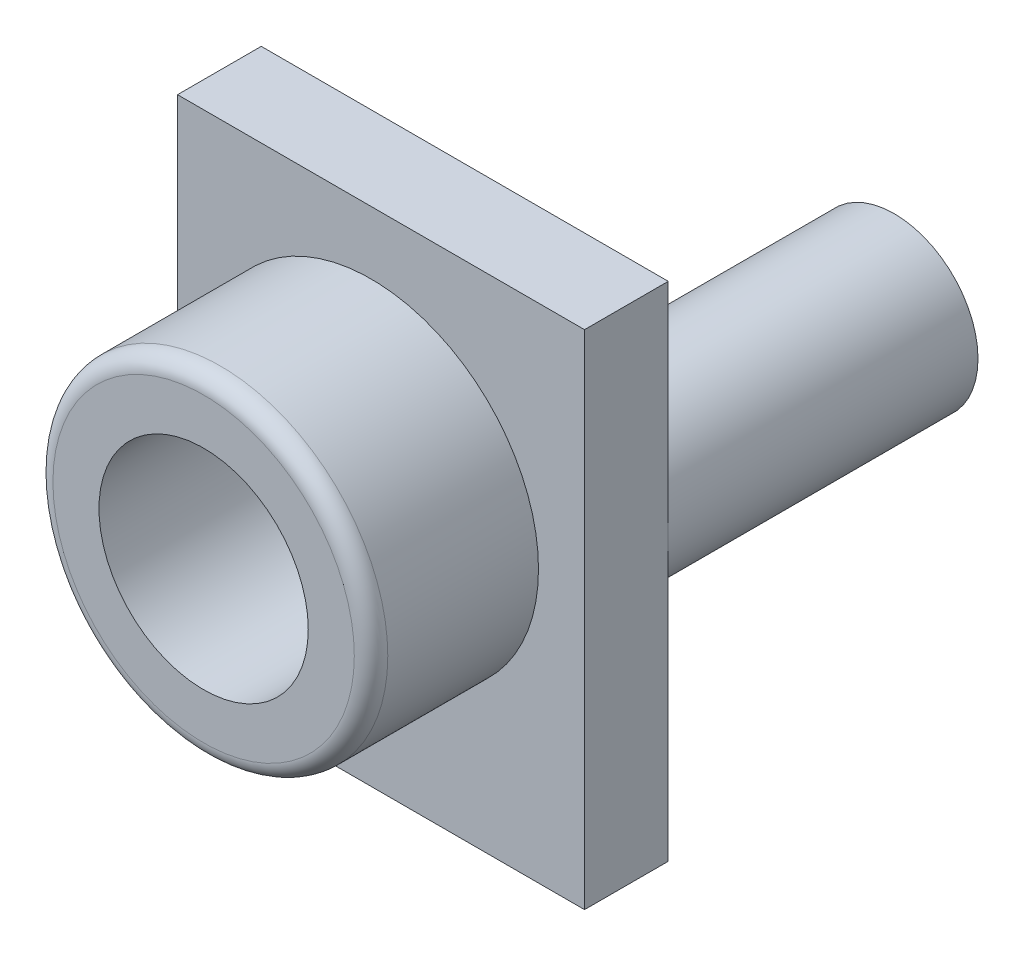
ISO-10303-21;
HEADER;
FILE_DESCRIPTION(('STEP AP214'),'2;1');
FILE_NAME('part.step','',(''),(''),'','','');
FILE_SCHEMA(('AUTOMOTIVE_DESIGN { 1 0 10303 214 1 1 1 1 }'));
ENDSEC;
DATA;
#1=APPLICATION_CONTEXT('core data for automotive mechanical design processes');
#2=APPLICATION_PROTOCOL_DEFINITION('international standard','automotive_design',2000,#1);
#3=PRODUCT_CONTEXT('',#1,'mechanical');
#4=PRODUCT('Part','Part','',(#3));
#5=PRODUCT_RELATED_PRODUCT_CATEGORY('part','',(#4));
#6=PRODUCT_DEFINITION_FORMATION('','',#4);
#7=PRODUCT_DEFINITION_CONTEXT('part definition',#1,'design');
#8=PRODUCT_DEFINITION('design','',#6,#7);
#9=PRODUCT_DEFINITION_SHAPE('','',#8);
#10=(LENGTH_UNIT() NAMED_UNIT(*) SI_UNIT(.MILLI.,.METRE.));
#11=(NAMED_UNIT(*) PLANE_ANGLE_UNIT() SI_UNIT($,.RADIAN.));
#12=(NAMED_UNIT(*) SI_UNIT($,.STERADIAN.) SOLID_ANGLE_UNIT());
#13=UNCERTAINTY_MEASURE_WITH_UNIT(LENGTH_MEASURE(1.E-05),#10,'distance_accuracy_value','');
#14=(GEOMETRIC_REPRESENTATION_CONTEXT(3) GLOBAL_UNCERTAINTY_ASSIGNED_CONTEXT((#13)) GLOBAL_UNIT_ASSIGNED_CONTEXT((#10,
#11,#12)) REPRESENTATION_CONTEXT('',''));
#15=CARTESIAN_POINT('',(0.,0.,0.));
#16=DIRECTION('',(0.,0.,1.));
#17=DIRECTION('',(1.,0.,0.));
#18=AXIS2_PLACEMENT_3D('',#15,#16,#17);
#19=CARTESIAN_POINT('',(-4.86158362662732,6.,2.));
#20=DIRECTION('',(1.,0.,0.));
#21=DIRECTION('',(0.,0.,-1.));
#22=AXIS2_PLACEMENT_3D('',#19,#20,#21);
#23=PLANE('',#22);
#24=DIRECTION('',(0.,-1.,0.));
#25=VECTOR('',#24,1.);
#26=CARTESIAN_POINT('',(-4.86158362662732,6.,0.));
#27=LINE('',#26,#25);
#28=CARTESIAN_POINT('',(-4.86158362662732,6.,0.));
#29=VERTEX_POINT('',#28);
#30=CARTESIAN_POINT('',(-4.86158362662732,-6.,0.));
#31=VERTEX_POINT('',#30);
#32=EDGE_CURVE('E103',#29,#31,#27,.T.);
#33=ORIENTED_EDGE('',*,*,#32,.T.);
#34=DIRECTION('',(0.,0.,-1.));
#35=VECTOR('',#34,1.);
#36=CARTESIAN_POINT('',(-4.86158362662732,-6.,2.));
#37=LINE('',#36,#35);
#38=CARTESIAN_POINT('',(-4.86158362662732,-6.,2.));
#39=VERTEX_POINT('',#38);
#40=EDGE_CURVE('E114',#39,#31,#37,.T.);
#41=ORIENTED_EDGE('',*,*,#40,.F.);
#42=DIRECTION('',(0.,-1.,0.));
#43=VECTOR('',#42,1.);
#44=CARTESIAN_POINT('',(-4.86158362662732,6.,2.));
#45=LINE('',#44,#43);
#46=CARTESIAN_POINT('',(-4.86158362662732,6.,2.));
#47=VERTEX_POINT('',#46);
#48=EDGE_CURVE('E108',#47,#39,#45,.T.);
#49=ORIENTED_EDGE('',*,*,#48,.F.);
#50=DIRECTION('',(0.,0.,-1.));
#51=VECTOR('',#50,1.);
#52=CARTESIAN_POINT('',(-4.86158362662732,6.,2.));
#53=LINE('',#52,#51);
#54=EDGE_CURVE('E109',#47,#29,#53,.T.);
#55=ORIENTED_EDGE('',*,*,#54,.T.);
#56=EDGE_LOOP('',(#33,#41,#49,#55));
#57=FACE_BOUND('',#56,.T.);
#58=ADVANCED_FACE('F38',(#57),#23,.F.);
#59=CARTESIAN_POINT('',(-4.86158362662732,-6.,2.));
#60=DIRECTION('',(0.,1.,0.));
#61=DIRECTION('',(0.,0.,1.));
#62=AXIS2_PLACEMENT_3D('',#59,#60,#61);
#63=PLANE('',#62);
#64=DIRECTION('',(1.,0.,0.));
#65=VECTOR('',#64,1.);
#66=CARTESIAN_POINT('',(-4.86158362662732,-6.,0.));
#67=LINE('',#66,#65);
#68=CARTESIAN_POINT('',(4.86158362662732,-6.,0.));
#69=VERTEX_POINT('',#68);
#70=EDGE_CURVE('E102',#31,#69,#67,.T.);
#71=ORIENTED_EDGE('',*,*,#70,.T.);
#72=DIRECTION('',(0.,0.,-1.));
#73=VECTOR('',#72,1.);
#74=CARTESIAN_POINT('',(4.86158362662732,-6.,2.));
#75=LINE('',#74,#73);
#76=CARTESIAN_POINT('',(4.86158362662732,-6.,2.));
#77=VERTEX_POINT('',#76);
#78=EDGE_CURVE('E94',#77,#69,#75,.T.);
#79=ORIENTED_EDGE('',*,*,#78,.F.);
#80=DIRECTION('',(1.,0.,0.));
#81=VECTOR('',#80,1.);
#82=CARTESIAN_POINT('',(-4.86158362662732,-6.,2.));
#83=LINE('',#82,#81);
#84=EDGE_CURVE('E87',#39,#77,#83,.T.);
#85=ORIENTED_EDGE('',*,*,#84,.F.);
#86=ORIENTED_EDGE('',*,*,#40,.T.);
#87=EDGE_LOOP('',(#71,#79,#85,#86));
#88=FACE_BOUND('',#87,.T.);
#89=ADVANCED_FACE('F135',(#88),#63,.F.);
#90=CARTESIAN_POINT('',(4.86158362662732,-6.,2.));
#91=DIRECTION('',(-1.,0.,0.));
#92=DIRECTION('',(0.,0.,1.));
#93=AXIS2_PLACEMENT_3D('',#90,#91,#92);
#94=PLANE('',#93);
#95=DIRECTION('',(0.,1.,0.));
#96=VECTOR('',#95,1.);
#97=CARTESIAN_POINT('',(4.86158362662732,-6.,0.));
#98=LINE('',#97,#96);
#99=CARTESIAN_POINT('',(4.86158362662732,0.700000000000001,0.));
#100=VERTEX_POINT('',#99);
#101=EDGE_CURVE('E91',#69,#100,#98,.T.);
#102=ORIENTED_EDGE('',*,*,#101,.T.);
#103=CARTESIAN_POINT('',(4.86158362662732,6.,0.));
#104=VERTEX_POINT('',#103);
#105=EDGE_CURVE('E73',#100,#104,#98,.T.);
#106=ORIENTED_EDGE('',*,*,#105,.T.);
#107=DIRECTION('',(0.,0.,-1.));
#108=VECTOR('',#107,1.);
#109=CARTESIAN_POINT('',(4.86158362662732,6.,2.));
#110=LINE('',#109,#108);
#111=CARTESIAN_POINT('',(4.86158362662732,6.,2.));
#112=VERTEX_POINT('',#111);
#113=EDGE_CURVE('E111',#112,#104,#110,.T.);
#114=ORIENTED_EDGE('',*,*,#113,.F.);
#115=DIRECTION('',(0.,1.,0.));
#116=VECTOR('',#115,1.);
#117=CARTESIAN_POINT('',(4.86158362662732,-6.,2.));
#118=LINE('',#117,#116);
#119=EDGE_CURVE('E186',#77,#112,#118,.T.);
#120=ORIENTED_EDGE('',*,*,#119,.F.);
#121=ORIENTED_EDGE('',*,*,#78,.T.);
#122=EDGE_LOOP('',(#102,#106,#114,#120,#121));
#123=FACE_BOUND('',#122,.T.);
#124=ADVANCED_FACE('F92',(#123),#94,.F.);
#125=CARTESIAN_POINT('',(4.86158362662732,6.,2.));
#126=DIRECTION('',(0.,-1.,0.));
#127=DIRECTION('',(0.,0.,-1.));
#128=AXIS2_PLACEMENT_3D('',#125,#126,#127);
#129=PLANE('',#128);
#130=DIRECTION('',(-1.,0.,0.));
#131=VECTOR('',#130,1.);
#132=CARTESIAN_POINT('',(4.86158362662732,6.,0.));
#133=LINE('',#132,#131);
#134=EDGE_CURVE('E79',#104,#29,#133,.T.);
#135=ORIENTED_EDGE('',*,*,#134,.T.);
#136=ORIENTED_EDGE('',*,*,#54,.F.);
#137=DIRECTION('',(-1.,0.,0.));
#138=VECTOR('',#137,1.);
#139=CARTESIAN_POINT('',(4.86158362662732,6.,2.));
#140=LINE('',#139,#138);
#141=EDGE_CURVE('E55',#112,#47,#140,.T.);
#142=ORIENTED_EDGE('',*,*,#141,.F.);
#143=ORIENTED_EDGE('',*,*,#113,.T.);
#144=EDGE_LOOP('',(#135,#136,#142,#143));
#145=FACE_BOUND('',#144,.T.);
#146=ADVANCED_FACE('F145',(#145),#129,.F.);
#147=CARTESIAN_POINT('',(0.,0.,2.));
#148=DIRECTION('',(0.,0.,1.));
#149=DIRECTION('',(1.,0.,0.));
#150=AXIS2_PLACEMENT_3D('',#147,#148,#149);
#151=PLANE('',#150);
#152=CARTESIAN_POINT('',(-0.238416373372685,0.499999999999999,2.));
#153=DIRECTION('',(0.,0.,1.));
#154=DIRECTION('',(1.,0.,0.));
#155=AXIS2_PLACEMENT_3D('',#152,#153,#154);
#156=CIRCLE('',#155,4.00000000000001);
#157=CARTESIAN_POINT('',(3.76158362662732,0.499999999999999,2.));
#158=VERTEX_POINT('',#157);
#159=EDGE_CURVE('E181',#158,#158,#156,.T.);
#160=ORIENTED_EDGE('',*,*,#159,.F.);
#161=EDGE_LOOP('',(#160));
#162=FACE_BOUND('',#161,.T.);
#163=ORIENTED_EDGE('',*,*,#48,.T.);
#164=ORIENTED_EDGE('',*,*,#84,.T.);
#165=ORIENTED_EDGE('',*,*,#119,.T.);
#166=ORIENTED_EDGE('',*,*,#141,.T.);
#167=EDGE_LOOP('',(#163,#164,#165,#166));
#168=FACE_BOUND('',#167,.T.);
#169=ADVANCED_FACE('F148',(#162,#168),#151,.T.);
#170=CARTESIAN_POINT('',(0.,0.,0.));
#171=DIRECTION('',(0.,0.,1.));
#172=DIRECTION('',(1.,0.,0.));
#173=AXIS2_PLACEMENT_3D('',#170,#171,#172);
#174=PLANE('',#173);
#175=ORIENTED_EDGE('',*,*,#105,.F.);
#176=CARTESIAN_POINT('',(2.86158362662732,0.700000000000001,0.));
#177=DIRECTION('',(0.,0.,-1.));
#178=DIRECTION('',(-1.,0.,0.));
#179=AXIS2_PLACEMENT_3D('',#176,#177,#178);
#180=CIRCLE('',#179,2.);
#181=EDGE_CURVE('E100',#100,#100,#180,.T.);
#182=ORIENTED_EDGE('',*,*,#181,.F.);
#183=ORIENTED_EDGE('',*,*,#101,.F.);
#184=ORIENTED_EDGE('',*,*,#70,.F.);
#185=ORIENTED_EDGE('',*,*,#32,.F.);
#186=ORIENTED_EDGE('',*,*,#134,.F.);
#187=EDGE_LOOP('',(#175,#182,#183,#184,#185,#186));
#188=FACE_BOUND('',#187,.T.);
#189=ADVANCED_FACE('F98',(#188),#174,.F.);
#190=CARTESIAN_POINT('',(-0.238416373372685,0.499999999999999,6.));
#191=DIRECTION('',(0.,0.,1.));
#192=DIRECTION('',(1.,0.,0.));
#193=AXIS2_PLACEMENT_3D('',#190,#191,#192);
#194=PLANE('',#193);
#195=CARTESIAN_POINT('',(-0.238416373372685,0.499999999999999,6.));
#196=DIRECTION('',(0.,0.,1.));
#197=DIRECTION('',(1.,0.,0.));
#198=AXIS2_PLACEMENT_3D('',#195,#196,#197);
#199=CIRCLE('',#198,3.60000000000001);
#200=CARTESIAN_POINT('',(3.36158362662732,0.499999999999999,6.));
#201=VERTEX_POINT('',#200);
#202=EDGE_CURVE('E47',#201,#201,#199,.T.);
#203=ORIENTED_EDGE('',*,*,#202,.T.);
#204=EDGE_LOOP('',(#203));
#205=FACE_BOUND('',#204,.T.);
#206=CARTESIAN_POINT('',(-0.238416373372685,0.499999999999999,6.));
#207=DIRECTION('',(0.,0.,1.));
#208=DIRECTION('',(1.,0.,0.));
#209=AXIS2_PLACEMENT_3D('',#206,#207,#208);
#210=CIRCLE('',#209,2.5);
#211=CARTESIAN_POINT('',(2.26158362662731,0.499999999999999,6.));
#212=VERTEX_POINT('',#211);
#213=EDGE_CURVE('E176',#212,#212,#210,.T.);
#214=ORIENTED_EDGE('',*,*,#213,.F.);
#215=EDGE_LOOP('',(#214));
#216=FACE_BOUND('',#215,.T.);
#217=ADVANCED_FACE('F121',(#205,#216),#194,.T.);
#218=CARTESIAN_POINT('',(-0.238416373372685,0.499999999999999,6.));
#219=DIRECTION('',(0.,0.,-1.));
#220=DIRECTION('',(-1.,0.,0.));
#221=AXIS2_PLACEMENT_3D('',#218,#219,#220);
#222=CYLINDRICAL_SURFACE('',#221,4.00000000000001);
#223=CARTESIAN_POINT('',(-0.238416373372685,0.499999999999999,5.6));
#224=DIRECTION('',(0.,0.,1.));
#225=DIRECTION('',(1.,0.,0.));
#226=AXIS2_PLACEMENT_3D('',#223,#224,#225);
#227=CIRCLE('',#226,4.00000000000001);
#228=CARTESIAN_POINT('',(3.76158362662732,0.499999999999999,5.6));
#229=VERTEX_POINT('',#228);
#230=EDGE_CURVE('E11',#229,#229,#227,.F.);
#231=ORIENTED_EDGE('',*,*,#230,.T.);
#232=EDGE_LOOP('',(#231));
#233=FACE_BOUND('',#232,.T.);
#234=ORIENTED_EDGE('',*,*,#159,.T.);
#235=EDGE_LOOP('',(#234));
#236=FACE_BOUND('',#235,.T.);
#237=ADVANCED_FACE('F155',(#233,#236),#222,.T.);
#238=CARTESIAN_POINT('',(-0.238416373372685,0.499999999999999,6.));
#239=DIRECTION('',(0.,0.,-1.));
#240=DIRECTION('',(-1.,0.,0.));
#241=AXIS2_PLACEMENT_3D('',#238,#239,#240);
#242=CYLINDRICAL_SURFACE('',#241,2.5);
#243=ORIENTED_EDGE('',*,*,#213,.T.);
#244=EDGE_LOOP('',(#243));
#245=FACE_BOUND('',#244,.T.);
#246=CARTESIAN_POINT('',(-0.238416373372685,0.499999999999999,2.));
#247=DIRECTION('',(0.,0.,1.));
#248=DIRECTION('',(1.,0.,0.));
#249=AXIS2_PLACEMENT_3D('',#246,#247,#248);
#250=CIRCLE('',#249,2.5);
#251=CARTESIAN_POINT('',(2.26158362662731,0.499999999999999,2.));
#252=VERTEX_POINT('',#251);
#253=EDGE_CURVE('E116',#252,#252,#250,.F.);
#254=ORIENTED_EDGE('',*,*,#253,.T.);
#255=EDGE_LOOP('',(#254));
#256=FACE_BOUND('',#255,.T.);
#257=ADVANCED_FACE('F158',(#245,#256),#242,.F.);
#258=ORIENTED_EDGE('',*,*,#253,.F.);
#259=EDGE_LOOP('',(#258));
#260=FACE_BOUND('',#259,.T.);
#261=ADVANCED_FACE('F154',(#260),#151,.T.);
#262=CARTESIAN_POINT('',(2.86158362662732,0.700000000000001,-7.4));
#263=DIRECTION('',(0.,0.,1.));
#264=DIRECTION('',(1.,0.,0.));
#265=AXIS2_PLACEMENT_3D('',#262,#263,#264);
#266=CYLINDRICAL_SURFACE('',#265,2.);
#267=CARTESIAN_POINT('',(2.86158362662732,0.700000000000001,-7.4));
#268=DIRECTION('',(0.,0.,-1.));
#269=DIRECTION('',(-1.,0.,0.));
#270=AXIS2_PLACEMENT_3D('',#267,#268,#269);
#271=CIRCLE('',#270,2.);
#272=CARTESIAN_POINT('',(0.861583626627324,0.700000000000001,-7.4));
#273=VERTEX_POINT('',#272);
#274=EDGE_CURVE('E174',#273,#273,#271,.T.);
#275=ORIENTED_EDGE('',*,*,#274,.F.);
#276=EDGE_LOOP('',(#275));
#277=FACE_BOUND('',#276,.T.);
#278=ORIENTED_EDGE('',*,*,#181,.T.);
#279=EDGE_LOOP('',(#278));
#280=FACE_BOUND('',#279,.T.);
#281=ADVANCED_FACE('F130',(#277,#280),#266,.T.);
#282=CARTESIAN_POINT('',(2.86158362662732,0.700000000000001,-7.4));
#283=DIRECTION('',(0.,0.,-1.));
#284=DIRECTION('',(-1.,0.,0.));
#285=AXIS2_PLACEMENT_3D('',#282,#283,#284);
#286=PLANE('',#285);
#287=ORIENTED_EDGE('',*,*,#274,.T.);
#288=EDGE_LOOP('',(#287));
#289=FACE_BOUND('',#288,.T.);
#290=ADVANCED_FACE('F125',(#289),#286,.T.);
#291=CARTESIAN_POINT('',(-0.238416373372685,0.499999999999999,5.6));
#292=DIRECTION('',(0.,0.,1.));
#293=DIRECTION('',(1.,0.,0.));
#294=AXIS2_PLACEMENT_3D('',#291,#292,#293);
#295=TOROIDAL_SURFACE('',#294,3.60000000000001,0.4);
#296=ORIENTED_EDGE('',*,*,#230,.F.);
#297=EDGE_LOOP('',(#296));
#298=FACE_BOUND('',#297,.T.);
#299=ORIENTED_EDGE('',*,*,#202,.F.);
#300=EDGE_LOOP('',(#299));
#301=FACE_BOUND('',#300,.T.);
#302=ADVANCED_FACE('F40',(#298,#301),#295,.T.);
#303=CLOSED_SHELL('',(#58,#89,#124,#146,#169,#189,#217,#237,#257,#261,#281,#290,#302));
#304=MANIFOLD_SOLID_BREP('B2',#303);
#305=ADVANCED_BREP_SHAPE_REPRESENTATION('',(#18,#304),#14);
#306=SHAPE_DEFINITION_REPRESENTATION(#9,#305);
ENDSEC;
END-ISO-10303-21;
